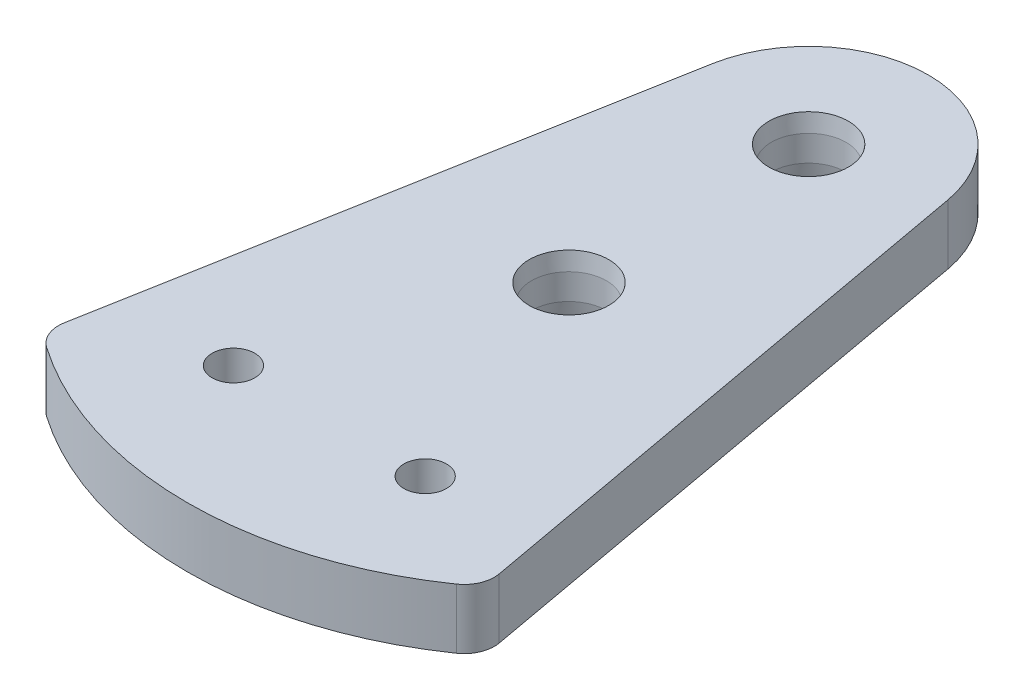
ISO-10303-21;
HEADER;
FILE_DESCRIPTION(('STEP AP214'),'2;1');
FILE_NAME('part.step','',(''),(''),'','','');
FILE_SCHEMA(('AUTOMOTIVE_DESIGN { 1 0 10303 214 1 1 1 1 }'));
ENDSEC;
DATA;
#1=APPLICATION_CONTEXT('core data for automotive mechanical design processes');
#2=APPLICATION_PROTOCOL_DEFINITION('international standard','automotive_design',2000,#1);
#3=PRODUCT_CONTEXT('',#1,'mechanical');
#4=PRODUCT('Part','Part','',(#3));
#5=PRODUCT_RELATED_PRODUCT_CATEGORY('part','',(#4));
#6=PRODUCT_DEFINITION_FORMATION('','',#4);
#7=PRODUCT_DEFINITION_CONTEXT('part definition',#1,'design');
#8=PRODUCT_DEFINITION('design','',#6,#7);
#9=PRODUCT_DEFINITION_SHAPE('','',#8);
#10=(LENGTH_UNIT() NAMED_UNIT(*) SI_UNIT(.MILLI.,.METRE.));
#11=(NAMED_UNIT(*) PLANE_ANGLE_UNIT() SI_UNIT($,.RADIAN.));
#12=(NAMED_UNIT(*) SI_UNIT($,.STERADIAN.) SOLID_ANGLE_UNIT());
#13=UNCERTAINTY_MEASURE_WITH_UNIT(LENGTH_MEASURE(1.E-05),#10,'distance_accuracy_value','');
#14=(GEOMETRIC_REPRESENTATION_CONTEXT(3) GLOBAL_UNCERTAINTY_ASSIGNED_CONTEXT((#13)) GLOBAL_UNIT_ASSIGNED_CONTEXT((#10,
#11,#12)) REPRESENTATION_CONTEXT('',''));
#15=CARTESIAN_POINT('',(0.,0.,0.));
#16=DIRECTION('',(0.,0.,1.));
#17=DIRECTION('',(1.,0.,0.));
#18=AXIS2_PLACEMENT_3D('',#15,#16,#17);
#19=CARTESIAN_POINT('',(0.,3.175,0.));
#20=DIRECTION('',(0.,-1.,0.));
#21=DIRECTION('',(0.,0.,-1.));
#22=AXIS2_PLACEMENT_3D('',#19,#20,#21);
#23=CYLINDRICAL_SURFACE('',#22,6.35);
#24=CARTESIAN_POINT('',(0.,0.,0.));
#25=DIRECTION('',(0.,1.,0.));
#26=DIRECTION('',(0.,0.,1.));
#27=AXIS2_PLACEMENT_3D('',#24,#25,#26);
#28=CIRCLE('',#27,6.35);
#29=CARTESIAN_POINT('',(6.24785215553024,0.,-1.1343912211561));
#30=VERTEX_POINT('',#29);
#31=CARTESIAN_POINT('',(-6.24785215553025,0.,-1.1343912211561));
#32=VERTEX_POINT('',#31);
#33=EDGE_CURVE('E122',#30,#32,#28,.T.);
#34=ORIENTED_EDGE('',*,*,#33,.T.);
#35=DIRECTION('',(0.,-1.,0.));
#36=VECTOR('',#35,1.);
#37=CARTESIAN_POINT('',(-6.24785215553025,3.175,-1.1343912211561));
#38=LINE('',#37,#36);
#39=CARTESIAN_POINT('',(-6.24785215553025,3.175,-1.1343912211561));
#40=VERTEX_POINT('',#39);
#41=EDGE_CURVE('E140',#40,#32,#38,.T.);
#42=ORIENTED_EDGE('',*,*,#41,.F.);
#43=CARTESIAN_POINT('',(0.,3.175,0.));
#44=DIRECTION('',(0.,1.,0.));
#45=DIRECTION('',(0.,0.,1.));
#46=AXIS2_PLACEMENT_3D('',#43,#44,#45);
#47=CIRCLE('',#46,6.35);
#48=CARTESIAN_POINT('',(6.24785215553024,3.175,-1.1343912211561));
#49=VERTEX_POINT('',#48);
#50=EDGE_CURVE('E133',#49,#40,#47,.T.);
#51=ORIENTED_EDGE('',*,*,#50,.F.);
#52=DIRECTION('',(0.,-1.,0.));
#53=VECTOR('',#52,1.);
#54=CARTESIAN_POINT('',(6.24785215553024,3.175,-1.1343912211561));
#55=LINE('',#54,#53);
#56=EDGE_CURVE('E118',#49,#30,#55,.T.);
#57=ORIENTED_EDGE('',*,*,#56,.T.);
#58=EDGE_LOOP('',(#34,#42,#51,#57));
#59=FACE_BOUND('',#58,.T.);
#60=ADVANCED_FACE('F36',(#59),#23,.T.);
#61=CARTESIAN_POINT('',(-6.24785215553025,3.175,-1.1343912211561));
#62=DIRECTION('',(0.983913725280354,0.,0.178644286796236));
#63=DIRECTION('',(0.178644286796236,0.,-0.983913725280354));
#64=AXIS2_PLACEMENT_3D('',#61,#62,#63);
#65=PLANE('',#64);
#66=DIRECTION('',(-0.178644286796236,0.,0.983913725280354));
#67=VECTOR('',#66,1.);
#68=CARTESIAN_POINT('',(-6.24785215553025,0.,-1.1343912211561));
#69=LINE('',#68,#67);
#70=CARTESIAN_POINT('',(-11.5228698457184,0.,27.9186638725833));
#71=VERTEX_POINT('',#70);
#72=EDGE_CURVE('E125',#32,#71,#69,.T.);
#73=ORIENTED_EDGE('',*,*,#72,.T.);
#74=DIRECTION('',(0.,-1.,0.));
#75=VECTOR('',#74,1.);
#76=CARTESIAN_POINT('',(-11.5228698457184,3.175,27.9186638725833));
#77=LINE('',#76,#75);
#78=CARTESIAN_POINT('',(-11.5228698457184,3.175,27.9186638725833));
#79=VERTEX_POINT('',#78);
#80=EDGE_CURVE('E137',#79,#71,#77,.T.);
#81=ORIENTED_EDGE('',*,*,#80,.F.);
#82=DIRECTION('',(-0.178644286796236,0.,0.983913725280354));
#83=VECTOR('',#82,1.);
#84=CARTESIAN_POINT('',(-6.24785215553025,3.175,-1.1343912211561));
#85=LINE('',#84,#83);
#86=EDGE_CURVE('E91',#40,#79,#85,.T.);
#87=ORIENTED_EDGE('',*,*,#86,.F.);
#88=ORIENTED_EDGE('',*,*,#41,.T.);
#89=EDGE_LOOP('',(#73,#81,#87,#88));
#90=FACE_BOUND('',#89,.T.);
#91=ADVANCED_FACE('F174',(#90),#65,.F.);
#92=CARTESIAN_POINT('',(-9.94841110252481,3.175,28.2045304603146));
#93=DIRECTION('',(0.,-1.,0.));
#94=DIRECTION('',(0.,0.,-1.));
#95=AXIS2_PLACEMENT_3D('',#92,#93,#94);
#96=CYLINDRICAL_SURFACE('',#95,1.6002);
#97=CARTESIAN_POINT('',(-9.94841110252481,0.,28.2045304603146));
#98=DIRECTION('',(0.,1.,0.));
#99=DIRECTION('',(0.,0.,1.));
#100=AXIS2_PLACEMENT_3D('',#97,#98,#99);
#101=CIRCLE('',#100,1.6002);
#102=CARTESIAN_POINT('',(-10.8607108106166,0.,29.5191974457583));
#103=VERTEX_POINT('',#102);
#104=EDGE_CURVE('E128',#71,#103,#101,.T.);
#105=ORIENTED_EDGE('',*,*,#104,.T.);
#106=DIRECTION('',(0.,-1.,0.));
#107=VECTOR('',#106,1.);
#108=CARTESIAN_POINT('',(-10.8607108106166,3.175,29.5191974457583));
#109=LINE('',#108,#107);
#110=CARTESIAN_POINT('',(-10.8607108106166,3.175,29.5191974457583));
#111=VERTEX_POINT('',#110);
#112=EDGE_CURVE('E113',#111,#103,#109,.T.);
#113=ORIENTED_EDGE('',*,*,#112,.F.);
#114=CARTESIAN_POINT('',(-9.94841110252481,3.175,28.2045304603146));
#115=DIRECTION('',(0.,1.,0.));
#116=DIRECTION('',(0.,0.,1.));
#117=AXIS2_PLACEMENT_3D('',#114,#115,#116);
#118=CIRCLE('',#117,1.6002);
#119=EDGE_CURVE('E104',#79,#111,#118,.T.);
#120=ORIENTED_EDGE('',*,*,#119,.F.);
#121=ORIENTED_EDGE('',*,*,#80,.T.);
#122=EDGE_LOOP('',(#105,#113,#120,#121));
#123=FACE_BOUND('',#122,.T.);
#124=ADVANCED_FACE('F180',(#123),#96,.T.);
#125=CARTESIAN_POINT('',(0.,3.175,13.8684));
#126=DIRECTION('',(0.,-1.,0.));
#127=DIRECTION('',(0.,0.,-1.));
#128=AXIS2_PLACEMENT_3D('',#125,#126,#127);
#129=CYLINDRICAL_SURFACE('',#128,19.05);
#130=CARTESIAN_POINT('',(0.,0.,13.8684));
#131=DIRECTION('',(0.,1.,0.));
#132=DIRECTION('',(0.,0.,1.));
#133=AXIS2_PLACEMENT_3D('',#130,#131,#132);
#134=CIRCLE('',#133,19.05);
#135=CARTESIAN_POINT('',(10.8607108106166,0.,29.5191974457583));
#136=VERTEX_POINT('',#135);
#137=EDGE_CURVE('E112',#103,#136,#134,.T.);
#138=ORIENTED_EDGE('',*,*,#137,.T.);
#139=DIRECTION('',(0.,-1.,0.));
#140=VECTOR('',#139,1.);
#141=CARTESIAN_POINT('',(10.8607108106166,3.175,29.5191974457583));
#142=LINE('',#141,#140);
#143=CARTESIAN_POINT('',(10.8607108106166,3.175,29.5191974457583));
#144=VERTEX_POINT('',#143);
#145=EDGE_CURVE('E109',#144,#136,#142,.T.);
#146=ORIENTED_EDGE('',*,*,#145,.F.);
#147=CARTESIAN_POINT('',(0.,3.175,13.8684));
#148=DIRECTION('',(0.,1.,0.));
#149=DIRECTION('',(0.,0.,1.));
#150=AXIS2_PLACEMENT_3D('',#147,#148,#149);
#151=CIRCLE('',#150,19.05);
#152=EDGE_CURVE('E98',#111,#144,#151,.T.);
#153=ORIENTED_EDGE('',*,*,#152,.F.);
#154=ORIENTED_EDGE('',*,*,#112,.T.);
#155=EDGE_LOOP('',(#138,#146,#153,#154));
#156=FACE_BOUND('',#155,.T.);
#157=ADVANCED_FACE('F110',(#156),#129,.T.);
#158=CARTESIAN_POINT('',(9.94841110252481,3.175,28.2045304603146));
#159=DIRECTION('',(0.,-1.,0.));
#160=DIRECTION('',(0.,0.,-1.));
#161=AXIS2_PLACEMENT_3D('',#158,#159,#160);
#162=CYLINDRICAL_SURFACE('',#161,1.6002);
#163=CARTESIAN_POINT('',(9.94841110252481,0.,28.2045304603146));
#164=DIRECTION('',(0.,1.,0.));
#165=DIRECTION('',(0.,0.,-1.));
#166=AXIS2_PLACEMENT_3D('',#163,#164,#165);
#167=CIRCLE('',#166,1.6002);
#168=CARTESIAN_POINT('',(11.5228698457184,0.,27.9186638725833));
#169=VERTEX_POINT('',#168);
#170=EDGE_CURVE('E76',#136,#169,#167,.T.);
#171=ORIENTED_EDGE('',*,*,#170,.T.);
#172=DIRECTION('',(0.,-1.,0.));
#173=VECTOR('',#172,1.);
#174=CARTESIAN_POINT('',(11.5228698457184,3.175,27.9186638725833));
#175=LINE('',#174,#173);
#176=CARTESIAN_POINT('',(11.5228698457184,3.175,27.9186638725833));
#177=VERTEX_POINT('',#176);
#178=EDGE_CURVE('E114',#177,#169,#175,.T.);
#179=ORIENTED_EDGE('',*,*,#178,.F.);
#180=CARTESIAN_POINT('',(9.94841110252481,3.175,28.2045304603146));
#181=DIRECTION('',(0.,1.,0.));
#182=DIRECTION('',(0.,0.,-1.));
#183=AXIS2_PLACEMENT_3D('',#180,#181,#182);
#184=CIRCLE('',#183,1.6002);
#185=EDGE_CURVE('E102',#144,#177,#184,.T.);
#186=ORIENTED_EDGE('',*,*,#185,.F.);
#187=ORIENTED_EDGE('',*,*,#145,.T.);
#188=EDGE_LOOP('',(#171,#179,#186,#187));
#189=FACE_BOUND('',#188,.T.);
#190=ADVANCED_FACE('F116',(#189),#162,.T.);
#191=CARTESIAN_POINT('',(11.5228698457184,3.175,27.9186638725833));
#192=DIRECTION('',(-0.983913725280354,0.,0.178644286796236));
#193=DIRECTION('',(0.178644286796236,0.,0.983913725280354));
#194=AXIS2_PLACEMENT_3D('',#191,#192,#193);
#195=PLANE('',#194);
#196=DIRECTION('',(-0.178644286796236,0.,-0.983913725280354));
#197=VECTOR('',#196,1.);
#198=CARTESIAN_POINT('',(11.5228698457184,0.,27.9186638725833));
#199=LINE('',#198,#197);
#200=EDGE_CURVE('E82',#169,#30,#199,.T.);
#201=ORIENTED_EDGE('',*,*,#200,.T.);
#202=ORIENTED_EDGE('',*,*,#56,.F.);
#203=DIRECTION('',(-0.178644286796236,0.,-0.983913725280354));
#204=VECTOR('',#203,1.);
#205=CARTESIAN_POINT('',(11.5228698457184,3.175,27.9186638725833));
#206=LINE('',#205,#204);
#207=EDGE_CURVE('E53',#177,#49,#206,.T.);
#208=ORIENTED_EDGE('',*,*,#207,.F.);
#209=ORIENTED_EDGE('',*,*,#178,.T.);
#210=EDGE_LOOP('',(#201,#202,#208,#209));
#211=FACE_BOUND('',#210,.T.);
#212=ADVANCED_FACE('F217',(#211),#195,.F.);
#213=CARTESIAN_POINT('',(0.,3.175,0.));
#214=DIRECTION('',(0.,1.,0.));
#215=DIRECTION('',(0.,0.,1.));
#216=AXIS2_PLACEMENT_3D('',#213,#214,#215);
#217=PLANE('',#216);
#218=CARTESIAN_POINT('',(0.,3.175,12.7));
#219=DIRECTION('',(0.,1.,0.));
#220=DIRECTION('',(0.,0.,1.));
#221=AXIS2_PLACEMENT_3D('',#218,#219,#220);
#222=CIRCLE('',#221,2.10820000000001);
#223=CARTESIAN_POINT('',(0.,3.175,14.8082));
#224=VERTEX_POINT('',#223);
#225=EDGE_CURVE('E151',#224,#224,#222,.F.);
#226=ORIENTED_EDGE('',*,*,#225,.T.);
#227=EDGE_LOOP('',(#226));
#228=FACE_BOUND('',#227,.T.);
#229=CARTESIAN_POINT('',(0.,3.175,0.));
#230=DIRECTION('',(0.,1.,0.));
#231=DIRECTION('',(0.,0.,1.));
#232=AXIS2_PLACEMENT_3D('',#229,#230,#231);
#233=CIRCLE('',#232,2.10820000000001);
#234=CARTESIAN_POINT('',(0.,3.175,2.10820000000001));
#235=VERTEX_POINT('',#234);
#236=EDGE_CURVE('E148',#235,#235,#233,.F.);
#237=ORIENTED_EDGE('',*,*,#236,.T.);
#238=EDGE_LOOP('',(#237));
#239=FACE_BOUND('',#238,.T.);
#240=CARTESIAN_POINT('',(-5.08,3.175,25.4));
#241=DIRECTION('',(0.,1.,0.));
#242=DIRECTION('',(0.,0.,1.));
#243=AXIS2_PLACEMENT_3D('',#240,#241,#242);
#244=CIRCLE('',#243,1.13029999999999);
#245=CARTESIAN_POINT('',(-5.08,3.175,26.5303));
#246=VERTEX_POINT('',#245);
#247=EDGE_CURVE('E247',#246,#246,#244,.T.);
#248=ORIENTED_EDGE('',*,*,#247,.F.);
#249=EDGE_LOOP('',(#248));
#250=FACE_BOUND('',#249,.T.);
#251=CARTESIAN_POINT('',(5.08,3.175,25.4));
#252=DIRECTION('',(0.,1.,0.));
#253=DIRECTION('',(0.,0.,1.));
#254=AXIS2_PLACEMENT_3D('',#251,#252,#253);
#255=CIRCLE('',#254,1.13029999999999);
#256=CARTESIAN_POINT('',(5.08,3.175,26.5303));
#257=VERTEX_POINT('',#256);
#258=EDGE_CURVE('E241',#257,#257,#255,.T.);
#259=ORIENTED_EDGE('',*,*,#258,.F.);
#260=EDGE_LOOP('',(#259));
#261=FACE_BOUND('',#260,.T.);
#262=ORIENTED_EDGE('',*,*,#50,.T.);
#263=ORIENTED_EDGE('',*,*,#86,.T.);
#264=ORIENTED_EDGE('',*,*,#119,.T.);
#265=ORIENTED_EDGE('',*,*,#152,.T.);
#266=ORIENTED_EDGE('',*,*,#185,.T.);
#267=ORIENTED_EDGE('',*,*,#207,.T.);
#268=EDGE_LOOP('',(#262,#263,#264,#265,#266,#267));
#269=FACE_BOUND('',#268,.T.);
#270=ADVANCED_FACE('F100',(#228,#239,#250,#261,#269),#217,.T.);
#271=CARTESIAN_POINT('',(0.,0.,0.));
#272=DIRECTION('',(0.,1.,0.));
#273=DIRECTION('',(0.,0.,1.));
#274=AXIS2_PLACEMENT_3D('',#271,#272,#273);
#275=PLANE('',#274);
#276=CARTESIAN_POINT('',(0.,0.,12.7));
#277=DIRECTION('',(0.,1.,0.));
#278=DIRECTION('',(0.,0.,1.));
#279=AXIS2_PLACEMENT_3D('',#276,#277,#278);
#280=CIRCLE('',#279,2.1082);
#281=CARTESIAN_POINT('',(0.,0.,14.8082));
#282=VERTEX_POINT('',#281);
#283=EDGE_CURVE('E157',#282,#282,#280,.T.);
#284=ORIENTED_EDGE('',*,*,#283,.T.);
#285=EDGE_LOOP('',(#284));
#286=FACE_BOUND('',#285,.T.);
#287=CARTESIAN_POINT('',(0.,0.,0.));
#288=DIRECTION('',(0.,1.,0.));
#289=DIRECTION('',(0.,0.,1.));
#290=AXIS2_PLACEMENT_3D('',#287,#288,#289);
#291=CIRCLE('',#290,2.1082);
#292=CARTESIAN_POINT('',(0.,0.,2.1082));
#293=VERTEX_POINT('',#292);
#294=EDGE_CURVE('E154',#293,#293,#291,.T.);
#295=ORIENTED_EDGE('',*,*,#294,.T.);
#296=EDGE_LOOP('',(#295));
#297=FACE_BOUND('',#296,.T.);
#298=CARTESIAN_POINT('',(-5.08,0.,25.4));
#299=DIRECTION('',(0.,1.,0.));
#300=DIRECTION('',(0.,0.,1.));
#301=AXIS2_PLACEMENT_3D('',#298,#299,#300);
#302=CIRCLE('',#301,1.1303);
#303=CARTESIAN_POINT('',(-5.08,0.,26.5303));
#304=VERTEX_POINT('',#303);
#305=EDGE_CURVE('E244',#304,#304,#302,.T.);
#306=ORIENTED_EDGE('',*,*,#305,.T.);
#307=EDGE_LOOP('',(#306));
#308=FACE_BOUND('',#307,.T.);
#309=CARTESIAN_POINT('',(5.08,0.,25.4));
#310=DIRECTION('',(0.,1.,0.));
#311=DIRECTION('',(0.,0.,1.));
#312=AXIS2_PLACEMENT_3D('',#309,#310,#311);
#313=CIRCLE('',#312,1.1303);
#314=CARTESIAN_POINT('',(5.08,0.,26.5303));
#315=VERTEX_POINT('',#314);
#316=EDGE_CURVE('E126',#315,#315,#313,.T.);
#317=ORIENTED_EDGE('',*,*,#316,.T.);
#318=EDGE_LOOP('',(#317));
#319=FACE_BOUND('',#318,.T.);
#320=ORIENTED_EDGE('',*,*,#33,.F.);
#321=ORIENTED_EDGE('',*,*,#200,.F.);
#322=ORIENTED_EDGE('',*,*,#170,.F.);
#323=ORIENTED_EDGE('',*,*,#137,.F.);
#324=ORIENTED_EDGE('',*,*,#104,.F.);
#325=ORIENTED_EDGE('',*,*,#72,.F.);
#326=EDGE_LOOP('',(#320,#321,#322,#323,#324,#325));
#327=FACE_BOUND('',#326,.T.);
#328=ADVANCED_FACE('F213',(#286,#297,#308,#319,#327),#275,.F.);
#329=CARTESIAN_POINT('',(5.08,3.175,25.4));
#330=DIRECTION('',(0.,1.,0.));
#331=DIRECTION('',(0.,0.,1.));
#332=AXIS2_PLACEMENT_3D('',#329,#330,#331);
#333=CYLINDRICAL_SURFACE('',#332,1.13029999999999);
#334=ORIENTED_EDGE('',*,*,#316,.F.);
#335=EDGE_LOOP('',(#334));
#336=FACE_BOUND('',#335,.T.);
#337=ORIENTED_EDGE('',*,*,#258,.T.);
#338=EDGE_LOOP('',(#337));
#339=FACE_BOUND('',#338,.T.);
#340=ADVANCED_FACE('F207',(#336,#339),#333,.F.);
#341=CARTESIAN_POINT('',(-5.08,3.175,25.4));
#342=DIRECTION('',(0.,1.,0.));
#343=DIRECTION('',(0.,0.,1.));
#344=AXIS2_PLACEMENT_3D('',#341,#342,#343);
#345=CYLINDRICAL_SURFACE('',#344,1.13029999999999);
#346=ORIENTED_EDGE('',*,*,#305,.F.);
#347=EDGE_LOOP('',(#346));
#348=FACE_BOUND('',#347,.T.);
#349=ORIENTED_EDGE('',*,*,#247,.T.);
#350=EDGE_LOOP('',(#349));
#351=FACE_BOUND('',#350,.T.);
#352=ADVANCED_FACE('F198',(#348,#351),#345,.F.);
#353=CARTESIAN_POINT('',(0.,-0.00100000000000013,12.7));
#354=DIRECTION('',(0.,1.,0.));
#355=DIRECTION('',(0.,0.,1.));
#356=AXIS2_PLACEMENT_3D('',#353,#354,#355);
#357=CYLINDRICAL_SURFACE('',#356,1.9812);
#358=CARTESIAN_POINT('',(0.,2.27134804525717,12.7));
#359=DIRECTION('',(0.,1.,0.));
#360=DIRECTION('',(0.,0.,1.));
#361=AXIS2_PLACEMENT_3D('',#358,#359,#360);
#362=CIRCLE('',#361,1.9812);
#363=CARTESIAN_POINT('',(0.,2.27134804525717,14.6812));
#364=VERTEX_POINT('',#363);
#365=EDGE_CURVE('E145',#364,#364,#362,.T.);
#366=ORIENTED_EDGE('',*,*,#365,.T.);
#367=EDGE_LOOP('',(#366));
#368=FACE_BOUND('',#367,.T.);
#369=CARTESIAN_POINT('',(0.,0.903651954742766,12.7));
#370=DIRECTION('',(0.,1.,0.));
#371=DIRECTION('',(0.,0.,1.));
#372=AXIS2_PLACEMENT_3D('',#369,#370,#371);
#373=CIRCLE('',#372,1.9812);
#374=CARTESIAN_POINT('',(0.,0.903651954742766,14.6812));
#375=VERTEX_POINT('',#374);
#376=EDGE_CURVE('E142',#375,#375,#373,.F.);
#377=ORIENTED_EDGE('',*,*,#376,.T.);
#378=EDGE_LOOP('',(#377));
#379=FACE_BOUND('',#378,.T.);
#380=ADVANCED_FACE('F196',(#368,#379),#357,.F.);
#381=CARTESIAN_POINT('',(0.,-0.00100000000000013,0.));
#382=DIRECTION('',(0.,1.,0.));
#383=DIRECTION('',(0.,0.,1.));
#384=AXIS2_PLACEMENT_3D('',#381,#382,#383);
#385=CYLINDRICAL_SURFACE('',#384,1.9812);
#386=CARTESIAN_POINT('',(0.,0.903651954742766,0.));
#387=DIRECTION('',(0.,1.,0.));
#388=DIRECTION('',(0.,0.,1.));
#389=AXIS2_PLACEMENT_3D('',#386,#387,#388);
#390=CIRCLE('',#389,1.9812);
#391=CARTESIAN_POINT('',(0.,0.903651954742766,1.9812));
#392=VERTEX_POINT('',#391);
#393=EDGE_CURVE('E11',#392,#392,#390,.F.);
#394=ORIENTED_EDGE('',*,*,#393,.T.);
#395=EDGE_LOOP('',(#394));
#396=FACE_BOUND('',#395,.T.);
#397=CARTESIAN_POINT('',(0.,2.27134804525717,0.));
#398=DIRECTION('',(0.,1.,0.));
#399=DIRECTION('',(0.,0.,1.));
#400=AXIS2_PLACEMENT_3D('',#397,#398,#399);
#401=CIRCLE('',#400,1.9812);
#402=CARTESIAN_POINT('',(0.,2.27134804525717,1.9812));
#403=VERTEX_POINT('',#402);
#404=EDGE_CURVE('E45',#403,#403,#401,.T.);
#405=ORIENTED_EDGE('',*,*,#404,.T.);
#406=EDGE_LOOP('',(#405));
#407=FACE_BOUND('',#406,.T.);
#408=ADVANCED_FACE('F162',(#396,#407),#385,.F.);
#409=CARTESIAN_POINT('',(0.,2.27134804525717,12.7));
#410=DIRECTION('',(0.,1.,0.));
#411=DIRECTION('',(0.,0.,1.));
#412=AXIS2_PLACEMENT_3D('',#409,#410,#411);
#413=CONICAL_SURFACE('',#412,1.9812,0.139626340159549);
#414=ORIENTED_EDGE('',*,*,#225,.F.);
#415=EDGE_LOOP('',(#414));
#416=FACE_BOUND('',#415,.T.);
#417=ORIENTED_EDGE('',*,*,#365,.F.);
#418=EDGE_LOOP('',(#417));
#419=FACE_BOUND('',#418,.T.);
#420=ADVANCED_FACE('F184',(#416,#419),#413,.F.);
#421=CARTESIAN_POINT('',(0.,0.903651954742766,12.7));
#422=DIRECTION('',(0.,-1.,0.));
#423=DIRECTION('',(0.,0.,-1.));
#424=AXIS2_PLACEMENT_3D('',#421,#422,#423);
#425=CONICAL_SURFACE('',#424,1.9812,0.139626340159548);
#426=ORIENTED_EDGE('',*,*,#283,.F.);
#427=EDGE_LOOP('',(#426));
#428=FACE_BOUND('',#427,.T.);
#429=ORIENTED_EDGE('',*,*,#376,.F.);
#430=EDGE_LOOP('',(#429));
#431=FACE_BOUND('',#430,.T.);
#432=ADVANCED_FACE('F170',(#428,#431),#425,.F.);
#433=CARTESIAN_POINT('',(0.,0.903651954742766,0.));
#434=DIRECTION('',(0.,-1.,0.));
#435=DIRECTION('',(0.,0.,-1.));
#436=AXIS2_PLACEMENT_3D('',#433,#434,#435);
#437=CONICAL_SURFACE('',#436,1.9812,0.139626340159546);
#438=ORIENTED_EDGE('',*,*,#294,.F.);
#439=EDGE_LOOP('',(#438));
#440=FACE_BOUND('',#439,.T.);
#441=ORIENTED_EDGE('',*,*,#393,.F.);
#442=EDGE_LOOP('',(#441));
#443=FACE_BOUND('',#442,.T.);
#444=ADVANCED_FACE('F165',(#440,#443),#437,.F.);
#445=CARTESIAN_POINT('',(0.,2.27134804525717,0.));
#446=DIRECTION('',(0.,1.,0.));
#447=DIRECTION('',(0.,0.,1.));
#448=AXIS2_PLACEMENT_3D('',#445,#446,#447);
#449=CONICAL_SURFACE('',#448,1.9812,0.139626340159546);
#450=ORIENTED_EDGE('',*,*,#236,.F.);
#451=EDGE_LOOP('',(#450));
#452=FACE_BOUND('',#451,.T.);
#453=ORIENTED_EDGE('',*,*,#404,.F.);
#454=EDGE_LOOP('',(#453));
#455=FACE_BOUND('',#454,.T.);
#456=ADVANCED_FACE('F38',(#452,#455),#449,.F.);
#457=CLOSED_SHELL('',(#60,#91,#124,#157,#190,#212,#270,#328,#340,#352,#380,#408,#420,#432,#444,#456));
#458=MANIFOLD_SOLID_BREP('B2',#457);
#459=ADVANCED_BREP_SHAPE_REPRESENTATION('',(#18,#458),#14);
#460=SHAPE_DEFINITION_REPRESENTATION(#9,#459);
ENDSEC;
END-ISO-10303-21;
